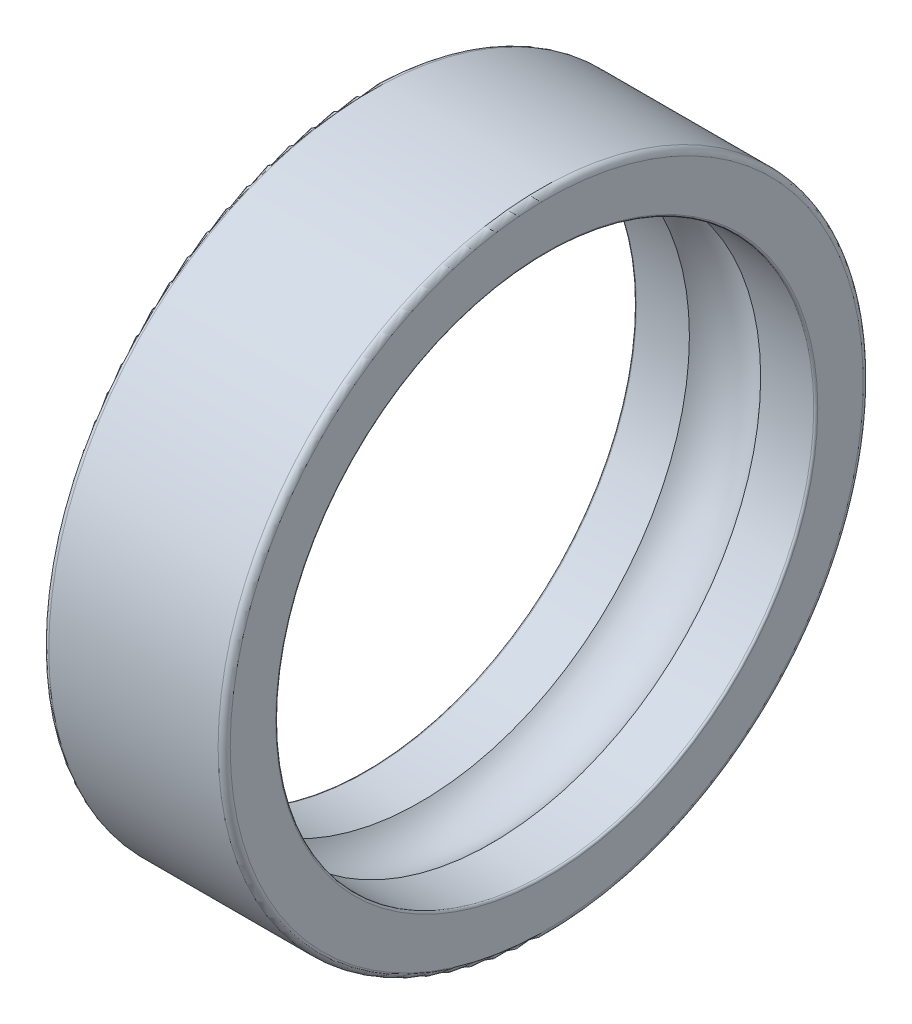
ISO-10303-21;
HEADER;
FILE_DESCRIPTION(('STEP AP214'),'2;1');
FILE_NAME('part.step','',(''),(''),'','','');
FILE_SCHEMA(('AUTOMOTIVE_DESIGN { 1 0 10303 214 1 1 1 1 }'));
ENDSEC;
DATA;
#1=APPLICATION_CONTEXT('core data for automotive mechanical design processes');
#2=APPLICATION_PROTOCOL_DEFINITION('international standard','automotive_design',2000,#1);
#3=PRODUCT_CONTEXT('',#1,'mechanical');
#4=PRODUCT('Part','Part','',(#3));
#5=PRODUCT_RELATED_PRODUCT_CATEGORY('part','',(#4));
#6=PRODUCT_DEFINITION_FORMATION('','',#4);
#7=PRODUCT_DEFINITION_CONTEXT('part definition',#1,'design');
#8=PRODUCT_DEFINITION('design','',#6,#7);
#9=PRODUCT_DEFINITION_SHAPE('','',#8);
#10=(LENGTH_UNIT() NAMED_UNIT(*) SI_UNIT(.MILLI.,.METRE.));
#11=(NAMED_UNIT(*) PLANE_ANGLE_UNIT() SI_UNIT($,.RADIAN.));
#12=(NAMED_UNIT(*) SI_UNIT($,.STERADIAN.) SOLID_ANGLE_UNIT());
#13=UNCERTAINTY_MEASURE_WITH_UNIT(LENGTH_MEASURE(1.E-05),#10,'distance_accuracy_value','');
#14=(GEOMETRIC_REPRESENTATION_CONTEXT(3) GLOBAL_UNCERTAINTY_ASSIGNED_CONTEXT((#13)) GLOBAL_UNIT_ASSIGNED_CONTEXT((#10,
#11,#12)) REPRESENTATION_CONTEXT('',''));
#15=CARTESIAN_POINT('',(0.,0.,0.));
#16=DIRECTION('',(0.,0.,1.));
#17=DIRECTION('',(1.,0.,0.));
#18=AXIS2_PLACEMENT_3D('',#15,#16,#17);
#19=CARTESIAN_POINT('',(0.299999999999941,0.,0.));
#20=DIRECTION('',(-1.,0.,0.));
#21=DIRECTION('',(0.,0.,1.));
#22=AXIS2_PLACEMENT_3D('',#19,#20,#21);
#23=TOROIDAL_SURFACE('',#22,15.7000000000001,0.29999999999994);
#24=CARTESIAN_POINT('',(0.,0.,0.));
#25=DIRECTION('',(-1.,0.,0.));
#26=DIRECTION('',(0.,0.,1.));
#27=AXIS2_PLACEMENT_3D('',#24,#25,#26);
#28=CIRCLE('',#27,15.7);
#29=CARTESIAN_POINT('',(0.,0.,15.7));
#30=VERTEX_POINT('',#29);
#31=EDGE_CURVE('E10',#30,#30,#28,.T.);
#32=ORIENTED_EDGE('',*,*,#31,.F.);
#33=EDGE_LOOP('',(#32));
#34=FACE_BOUND('',#33,.T.);
#35=CARTESIAN_POINT('',(0.300000000000002,0.,0.));
#36=DIRECTION('',(-1.,0.,0.));
#37=DIRECTION('',(0.,0.,1.));
#38=AXIS2_PLACEMENT_3D('',#35,#36,#37);
#39=CIRCLE('',#38,16.);
#40=CARTESIAN_POINT('',(0.300000000000002,0.,16.));
#41=VERTEX_POINT('',#40);
#42=EDGE_CURVE('E69',#41,#41,#39,.T.);
#43=ORIENTED_EDGE('',*,*,#42,.T.);
#44=EDGE_LOOP('',(#43));
#45=FACE_BOUND('',#44,.T.);
#46=ADVANCED_FACE('F35',(#34,#45),#23,.T.);
#47=CARTESIAN_POINT('',(0.,15.7,0.));
#48=DIRECTION('',(1.,0.,0.));
#49=DIRECTION('',(0.,0.,-1.));
#50=AXIS2_PLACEMENT_3D('',#47,#48,#49);
#51=PLANE('',#50);
#52=CARTESIAN_POINT('',(0.,0.,0.));
#53=DIRECTION('',(-1.,0.,0.));
#54=DIRECTION('',(0.,0.,1.));
#55=AXIS2_PLACEMENT_3D('',#52,#53,#54);
#56=CIRCLE('',#55,13.445);
#57=CARTESIAN_POINT('',(0.,0.,13.445));
#58=VERTEX_POINT('',#57);
#59=EDGE_CURVE('E41',#58,#58,#56,.T.);
#60=ORIENTED_EDGE('',*,*,#59,.F.);
#61=EDGE_LOOP('',(#60));
#62=FACE_BOUND('',#61,.T.);
#63=ORIENTED_EDGE('',*,*,#31,.T.);
#64=EDGE_LOOP('',(#63));
#65=FACE_BOUND('',#64,.T.);
#66=ADVANCED_FACE('F118',(#62,#65),#51,.F.);
#67=CARTESIAN_POINT('',(0.0999999999994116,0.,0.));
#68=DIRECTION('',(-1.,0.,0.));
#69=DIRECTION('',(0.,0.,1.));
#70=AXIS2_PLACEMENT_3D('',#67,#68,#69);
#71=TOROIDAL_SURFACE('',#70,13.4449999999994,0.0999999999994115);
#72=CARTESIAN_POINT('',(0.100000000000003,0.,0.));
#73=DIRECTION('',(-1.,0.,0.));
#74=DIRECTION('',(0.,0.,1.));
#75=AXIS2_PLACEMENT_3D('',#72,#73,#74);
#76=CIRCLE('',#75,13.345);
#77=CARTESIAN_POINT('',(0.100000000000003,0.,13.345));
#78=VERTEX_POINT('',#77);
#79=EDGE_CURVE('E45',#78,#78,#76,.T.);
#80=ORIENTED_EDGE('',*,*,#79,.F.);
#81=EDGE_LOOP('',(#80));
#82=FACE_BOUND('',#81,.T.);
#83=ORIENTED_EDGE('',*,*,#59,.T.);
#84=EDGE_LOOP('',(#83));
#85=FACE_BOUND('',#84,.T.);
#86=ADVANCED_FACE('F113',(#82,#85),#71,.T.);
#87=CARTESIAN_POINT('',(50.,0.,0.));
#88=DIRECTION('',(-1.,0.,0.));
#89=DIRECTION('',(0.,0.,1.));
#90=AXIS2_PLACEMENT_3D('',#87,#88,#89);
#91=CYLINDRICAL_SURFACE('',#90,13.345);
#92=CARTESIAN_POINT('',(2.7321945808432,0.,0.));
#93=DIRECTION('',(-1.,0.,0.));
#94=DIRECTION('',(0.,0.,1.));
#95=AXIS2_PLACEMENT_3D('',#92,#93,#94);
#96=CIRCLE('',#95,13.345);
#97=CARTESIAN_POINT('',(2.7321945808432,0.,13.345));
#98=VERTEX_POINT('',#97);
#99=EDGE_CURVE('E49',#98,#98,#96,.T.);
#100=ORIENTED_EDGE('',*,*,#99,.F.);
#101=EDGE_LOOP('',(#100));
#102=FACE_BOUND('',#101,.T.);
#103=ORIENTED_EDGE('',*,*,#79,.T.);
#104=EDGE_LOOP('',(#103));
#105=FACE_BOUND('',#104,.T.);
#106=ADVANCED_FACE('F107',(#102,#105),#91,.F.);
#107=CARTESIAN_POINT('',(4.5,0.,0.));
#108=DIRECTION('',(-1.,0.,0.));
#109=DIRECTION('',(0.,0.,1.));
#110=AXIS2_PLACEMENT_3D('',#107,#108,#109);
#111=TOROIDAL_SURFACE('',#110,11.7499999999999,2.3810000000001);
#112=CARTESIAN_POINT('',(6.2678054191568,0.,0.));
#113=DIRECTION('',(-1.,0.,0.));
#114=DIRECTION('',(0.,0.,1.));
#115=AXIS2_PLACEMENT_3D('',#112,#113,#114);
#116=CIRCLE('',#115,13.345);
#117=CARTESIAN_POINT('',(6.2678054191568,0.,13.345));
#118=VERTEX_POINT('',#117);
#119=EDGE_CURVE('E54',#118,#118,#116,.T.);
#120=ORIENTED_EDGE('',*,*,#119,.F.);
#121=EDGE_LOOP('',(#120));
#122=FACE_BOUND('',#121,.T.);
#123=ORIENTED_EDGE('',*,*,#99,.T.);
#124=EDGE_LOOP('',(#123));
#125=FACE_BOUND('',#124,.T.);
#126=ADVANCED_FACE('F101',(#122,#125),#111,.F.);
#127=CARTESIAN_POINT('',(50.,0.,0.));
#128=DIRECTION('',(-1.,0.,0.));
#129=DIRECTION('',(0.,0.,1.));
#130=AXIS2_PLACEMENT_3D('',#127,#128,#129);
#131=CYLINDRICAL_SURFACE('',#130,13.345);
#132=CARTESIAN_POINT('',(8.9,0.,0.));
#133=DIRECTION('',(-1.,0.,0.));
#134=DIRECTION('',(0.,0.,1.));
#135=AXIS2_PLACEMENT_3D('',#132,#133,#134);
#136=CIRCLE('',#135,13.345);
#137=CARTESIAN_POINT('',(8.9,0.,13.345));
#138=VERTEX_POINT('',#137);
#139=EDGE_CURVE('E57',#138,#138,#136,.T.);
#140=ORIENTED_EDGE('',*,*,#139,.F.);
#141=EDGE_LOOP('',(#140));
#142=FACE_BOUND('',#141,.T.);
#143=ORIENTED_EDGE('',*,*,#119,.T.);
#144=EDGE_LOOP('',(#143));
#145=FACE_BOUND('',#144,.T.);
#146=ADVANCED_FACE('F95',(#142,#145),#131,.F.);
#147=CARTESIAN_POINT('',(8.90000000000066,0.,0.));
#148=DIRECTION('',(-1.,0.,0.));
#149=DIRECTION('',(0.,0.,1.));
#150=AXIS2_PLACEMENT_3D('',#147,#148,#149);
#151=TOROIDAL_SURFACE('',#150,13.4449999999993,0.099999999999335);
#152=CARTESIAN_POINT('',(9.,0.,0.));
#153=DIRECTION('',(-1.,0.,0.));
#154=DIRECTION('',(0.,0.,1.));
#155=AXIS2_PLACEMENT_3D('',#152,#153,#154);
#156=CIRCLE('',#155,13.4449999999993);
#157=CARTESIAN_POINT('',(9.,0.,13.4449999999993));
#158=VERTEX_POINT('',#157);
#159=EDGE_CURVE('E60',#158,#158,#156,.T.);
#160=ORIENTED_EDGE('',*,*,#159,.F.);
#161=EDGE_LOOP('',(#160));
#162=FACE_BOUND('',#161,.T.);
#163=ORIENTED_EDGE('',*,*,#139,.T.);
#164=EDGE_LOOP('',(#163));
#165=FACE_BOUND('',#164,.T.);
#166=ADVANCED_FACE('F89',(#162,#165),#151,.T.);
#167=CARTESIAN_POINT('',(9.,13.445,0.));
#168=DIRECTION('',(-1.,0.,0.));
#169=DIRECTION('',(0.,0.,1.));
#170=AXIS2_PLACEMENT_3D('',#167,#168,#169);
#171=PLANE('',#170);
#172=CARTESIAN_POINT('',(9.,0.,0.));
#173=DIRECTION('',(-1.,0.,0.));
#174=DIRECTION('',(0.,0.,1.));
#175=AXIS2_PLACEMENT_3D('',#172,#173,#174);
#176=CIRCLE('',#175,15.7);
#177=CARTESIAN_POINT('',(9.,0.,15.7));
#178=VERTEX_POINT('',#177);
#179=EDGE_CURVE('E63',#178,#178,#176,.T.);
#180=ORIENTED_EDGE('',*,*,#179,.F.);
#181=EDGE_LOOP('',(#180));
#182=FACE_BOUND('',#181,.T.);
#183=ORIENTED_EDGE('',*,*,#159,.T.);
#184=EDGE_LOOP('',(#183));
#185=FACE_BOUND('',#184,.T.);
#186=ADVANCED_FACE('F83',(#182,#185),#171,.F.);
#187=CARTESIAN_POINT('',(8.70000000000012,0.,0.));
#188=DIRECTION('',(-1.,0.,0.));
#189=DIRECTION('',(0.,0.,1.));
#190=AXIS2_PLACEMENT_3D('',#187,#188,#189);
#191=TOROIDAL_SURFACE('',#190,15.7000000000001,0.299999999999878);
#192=CARTESIAN_POINT('',(8.7,0.,0.));
#193=DIRECTION('',(-1.,0.,0.));
#194=DIRECTION('',(0.,0.,1.));
#195=AXIS2_PLACEMENT_3D('',#192,#193,#194);
#196=CIRCLE('',#195,16.);
#197=CARTESIAN_POINT('',(8.7,0.,16.));
#198=VERTEX_POINT('',#197);
#199=EDGE_CURVE('E66',#198,#198,#196,.T.);
#200=ORIENTED_EDGE('',*,*,#199,.F.);
#201=EDGE_LOOP('',(#200));
#202=FACE_BOUND('',#201,.T.);
#203=ORIENTED_EDGE('',*,*,#179,.T.);
#204=EDGE_LOOP('',(#203));
#205=FACE_BOUND('',#204,.T.);
#206=ADVANCED_FACE('F77',(#202,#205),#191,.T.);
#207=CARTESIAN_POINT('',(50.,0.,0.));
#208=DIRECTION('',(-1.,0.,0.));
#209=DIRECTION('',(0.,0.,1.));
#210=AXIS2_PLACEMENT_3D('',#207,#208,#209);
#211=CYLINDRICAL_SURFACE('',#210,16.);
#212=ORIENTED_EDGE('',*,*,#42,.F.);
#213=EDGE_LOOP('',(#212));
#214=FACE_BOUND('',#213,.T.);
#215=ORIENTED_EDGE('',*,*,#199,.T.);
#216=EDGE_LOOP('',(#215));
#217=FACE_BOUND('',#216,.T.);
#218=ADVANCED_FACE('F74',(#214,#217),#211,.T.);
#219=CLOSED_SHELL('',(#46,#66,#86,#106,#126,#146,#166,#186,#206,#218));
#220=MANIFOLD_SOLID_BREP('B2',#219);
#221=ADVANCED_BREP_SHAPE_REPRESENTATION('',(#18,#220),#14);
#222=SHAPE_DEFINITION_REPRESENTATION(#9,#221);
ENDSEC;
END-ISO-10303-21;
